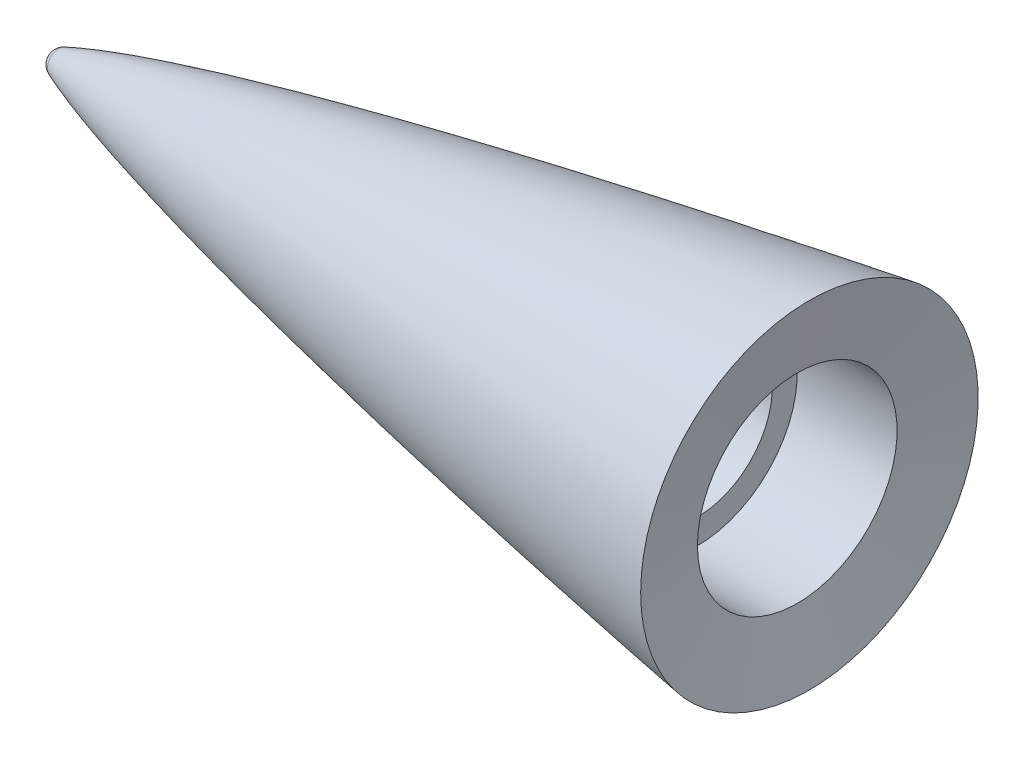
ISO-10303-21;
HEADER;
FILE_DESCRIPTION(('STEP AP214'),'2;1');
FILE_NAME('part.step','',(''),(''),'','','');
FILE_SCHEMA(('AUTOMOTIVE_DESIGN { 1 0 10303 214 1 1 1 1 }'));
ENDSEC;
DATA;
#1=APPLICATION_CONTEXT('core data for automotive mechanical design processes');
#2=APPLICATION_PROTOCOL_DEFINITION('international standard','automotive_design',2000,#1);
#3=PRODUCT_CONTEXT('',#1,'mechanical');
#4=PRODUCT('Part','Part','',(#3));
#5=PRODUCT_RELATED_PRODUCT_CATEGORY('part','',(#4));
#6=PRODUCT_DEFINITION_FORMATION('','',#4);
#7=PRODUCT_DEFINITION_CONTEXT('part definition',#1,'design');
#8=PRODUCT_DEFINITION('design','',#6,#7);
#9=PRODUCT_DEFINITION_SHAPE('','',#8);
#10=(LENGTH_UNIT() NAMED_UNIT(*) SI_UNIT(.MILLI.,.METRE.));
#11=(NAMED_UNIT(*) PLANE_ANGLE_UNIT() SI_UNIT($,.RADIAN.));
#12=(NAMED_UNIT(*) SI_UNIT($,.STERADIAN.) SOLID_ANGLE_UNIT());
#13=UNCERTAINTY_MEASURE_WITH_UNIT(LENGTH_MEASURE(1.E-05),#10,'distance_accuracy_value','');
#14=(GEOMETRIC_REPRESENTATION_CONTEXT(3) GLOBAL_UNCERTAINTY_ASSIGNED_CONTEXT((#13)) GLOBAL_UNIT_ASSIGNED_CONTEXT((#10,
#11,#12)) REPRESENTATION_CONTEXT('',''));
#15=CARTESIAN_POINT('',(0.,0.,0.));
#16=DIRECTION('',(0.,0.,1.));
#17=DIRECTION('',(1.,0.,0.));
#18=AXIS2_PLACEMENT_3D('',#15,#16,#17);
#19=CARTESIAN_POINT('',(83.9194053925777,0.,-12.6999999999991));
#20=DIRECTION('',(-1.,0.,0.));
#21=DIRECTION('',(0.,0.,1.));
#22=AXIS2_PLACEMENT_3D('',#19,#20,#21);
#23=PLANE('',#22);
#24=CARTESIAN_POINT('',(83.9194053925777,0.,0.));
#25=DIRECTION('',(-1.,0.,0.));
#26=DIRECTION('',(0.,0.,1.));
#27=AXIS2_PLACEMENT_3D('',#24,#25,#26);
#28=CIRCLE('',#27,12.6999999999991);
#29=CARTESIAN_POINT('',(83.9194053925777,0.,12.6999999999991));
#30=VERTEX_POINT('',#29);
#31=EDGE_CURVE('E11',#30,#30,#28,.T.);
#32=ORIENTED_EDGE('',*,*,#31,.F.);
#33=EDGE_LOOP('',(#32));
#34=FACE_BOUND('',#33,.T.);
#35=CARTESIAN_POINT('',(83.9194053925777,0.,0.));
#36=DIRECTION('',(-1.,0.,0.));
#37=DIRECTION('',(0.,0.,1.));
#38=AXIS2_PLACEMENT_3D('',#35,#36,#37);
#39=CIRCLE('',#38,9.525);
#40=CARTESIAN_POINT('',(83.9194053925777,0.,9.525));
#41=VERTEX_POINT('',#40);
#42=EDGE_CURVE('E69',#41,#41,#39,.T.);
#43=ORIENTED_EDGE('',*,*,#42,.T.);
#44=EDGE_LOOP('',(#43));
#45=FACE_BOUND('',#44,.T.);
#46=ADVANCED_FACE('F32',(#34,#45),#23,.F.);
#47=CARTESIAN_POINT('',(0.,0.,0.));
#48=DIRECTION('',(-1.,0.,0.));
#49=DIRECTION('',(0.,0.,1.));
#50=AXIS2_PLACEMENT_3D('',#47,#48,#49);
#51=CYLINDRICAL_SURFACE('',#50,12.6999999999991);
#52=CARTESIAN_POINT('',(96.6194053925777,0.,0.));
#53=DIRECTION('',(-1.,0.,0.));
#54=DIRECTION('',(0.,0.,1.));
#55=AXIS2_PLACEMENT_3D('',#52,#53,#54);
#56=CIRCLE('',#55,12.6999999999991);
#57=CARTESIAN_POINT('',(96.6194053925777,0.,12.6999999999991));
#58=VERTEX_POINT('',#57);
#59=EDGE_CURVE('E38',#58,#58,#56,.T.);
#60=ORIENTED_EDGE('',*,*,#59,.F.);
#61=EDGE_LOOP('',(#60));
#62=FACE_BOUND('',#61,.T.);
#63=ORIENTED_EDGE('',*,*,#31,.T.);
#64=EDGE_LOOP('',(#63));
#65=FACE_BOUND('',#64,.T.);
#66=ADVANCED_FACE('F58',(#62,#65),#51,.F.);
#67=CARTESIAN_POINT('',(96.6194053925777,0.,0.));
#68=DIRECTION('',(1.,0.,0.));
#69=DIRECTION('',(0.,0.,-1.));
#70=AXIS2_PLACEMENT_3D('',#67,#68,#69);
#71=CONICAL_SURFACE('',#70,12.6999999999991,1.3962634012734);
#72=CARTESIAN_POINT('',(98.1654285822377,0.,0.));
#73=DIRECTION('',(-1.,0.,0.));
#74=DIRECTION('',(0.,0.,1.));
#75=AXIS2_PLACEMENT_3D('',#72,#73,#74);
#76=CIRCLE('',#75,21.4679331917128);
#77=CARTESIAN_POINT('',(98.1654285822377,0.,21.4679331917128));
#78=VERTEX_POINT('',#77);
#79=EDGE_CURVE('E82',#78,#78,#76,.T.);
#80=ORIENTED_EDGE('',*,*,#79,.F.);
#81=EDGE_LOOP('',(#80));
#82=FACE_BOUND('',#81,.T.);
#83=ORIENTED_EDGE('',*,*,#59,.T.);
#84=EDGE_LOOP('',(#83));
#85=FACE_BOUND('',#84,.T.);
#86=ADVANCED_FACE('F63',(#82,#85),#71,.F.);
#87=CARTESIAN_POINT('',(98.1654285822377,0.,-21.4679331917128));
#88=CARTESIAN_POINT('',(98.164963491653,0.,-21.4678588449244));
#89=CARTESIAN_POINT('',(97.3333723487105,0.,-21.334925018947));
#90=CARTESIAN_POINT('',(95.6643282605515,0.,-21.0670430360893));
#91=CARTESIAN_POINT('',(92.4583875897154,0.,-20.5496454295419));
#92=CARTESIAN_POINT('',(89.1687402481209,0.,-20.01035749334));
#93=CARTESIAN_POINT('',(85.3070651026785,0.,-19.3724410882181));
#94=CARTESIAN_POINT('',(81.7849613772071,0.,-18.7812835294238));
#95=CARTESIAN_POINT('',(78.0654253465569,0.,-18.1506618123487));
#96=CARTESIAN_POINT('',(74.4590688039419,0.,-17.529825957153));
#97=CARTESIAN_POINT('',(69.8838967805536,0.,-16.7320623592298));
#98=CARTESIAN_POINT('',(64.433980883078,0.,-15.762645369331));
#99=CARTESIAN_POINT('',(58.0581539205274,0.,-14.599266319204));
#100=CARTESIAN_POINT('',(50.7937769881176,0.,-13.2269844957505));
#101=CARTESIAN_POINT('',(43.5319010479667,0.,-11.8011118443972));
#102=CARTESIAN_POINT('',(36.2869207738544,0.,-10.3137447182511));
#103=CARTESIAN_POINT('',(29.0553638889182,0.,-8.74917784058436));
#104=CARTESIAN_POINT('',(21.8473172630035,0.,-7.08667894424691));
#105=CARTESIAN_POINT('',(15.352608070185,0.,-5.45893404606891));
#106=CARTESIAN_POINT('',(9.95928520495974,0.,-3.96140285403248));
#107=CARTESIAN_POINT('',(6.07554274334884,0.,-2.73558534633014));
#108=CARTESIAN_POINT('',(3.98276576435626,0.,-1.9869769133939));
#109=CARTESIAN_POINT('',(2.98209212703007,0.,-1.59174228336096));
#110=CARTESIAN_POINT('',(2.6821271482151,0.,-1.46864436174974));
#111=B_SPLINE_CURVE_WITH_KNOTS('',4,(#87,#88,#89,#90,#91,#92,#93,#94,#95,#96,#97,#98,#99,#100,
#101,#102,#103,#104,#105,#106,#107,#108,#109,#110),.UNSPECIFIED.,.F.,.F.,(5,1,1,1,1,1,1,1,1,1,1,
1,1,1,1,1,1,1,1,1,5),(0.0278472915350182,0.0278659926056248,0.0612851050735975,0.09470421754157,
0.128123330738758,0.161542443935946,0.19496155644806,0.228380668960175,0.261799782409289,
0.295218895858403,0.362057120379117,0.428895345791075,0.495733571811544,0.562571797597869,
0.629410022064906,0.696248245183594,0.763086473220192,0.829924693268996,0.871354334931829,
0.898515123135413,0.910233153347239),.UNSPECIFIED.);
#112=CARTESIAN_POINT('',(0.,0.,0.));
#113=DIRECTION('',(-1.,0.,0.));
#114=AXIS1_PLACEMENT('',#112,#113);
#115=SURFACE_OF_REVOLUTION('',#111,#114);
#116=CARTESIAN_POINT('',(2.68212714820225,0.,0.));
#117=DIRECTION('',(-1.,0.,0.));
#118=DIRECTION('',(0.,0.,1.));
#119=AXIS2_PLACEMENT_3D('',#116,#117,#118);
#120=CIRCLE('',#119,1.46864436174447);
#121=CARTESIAN_POINT('',(2.68212714820225,0.,1.46864436174447));
#122=VERTEX_POINT('',#121);
#123=EDGE_CURVE('E73',#122,#122,#120,.T.);
#124=ORIENTED_EDGE('',*,*,#123,.F.);
#125=EDGE_LOOP('',(#124));
#126=FACE_BOUND('',#125,.T.);
#127=ORIENTED_EDGE('',*,*,#79,.T.);
#128=EDGE_LOOP('',(#127));
#129=FACE_BOUND('',#128,.T.);
#130=ADVANCED_FACE('F53',(#126,#129),#115,.T.);
#131=CARTESIAN_POINT('',(3.28482109105042,0.,-1.01075831732134E-11));
#132=DIRECTION('',(-1.,0.,0.));
#133=DIRECTION('',(0.,0.,-1.));
#134=AXIS2_PLACEMENT_3D('',#131,#132,#133);
#135=SPHERICAL_SURFACE('',#134,1.5875);
#136=ORIENTED_EDGE('',*,*,#123,.T.);
#137=EDGE_LOOP('',(#136));
#138=FACE_BOUND('',#137,.T.);
#139=ADVANCED_FACE('F44',(#138),#135,.T.);
#140=CARTESIAN_POINT('',(45.8194053925777,0.,0.));
#141=DIRECTION('',(1.,0.,0.));
#142=DIRECTION('',(0.,0.,-1.));
#143=AXIS2_PLACEMENT_3D('',#140,#141,#142);
#144=CONICAL_SURFACE('',#143,0.,0.643501108793284);
#145=CARTESIAN_POINT('',(58.5194053925776,0.,0.));
#146=DIRECTION('',(-1.,0.,0.));
#147=DIRECTION('',(0.,0.,1.));
#148=AXIS2_PLACEMENT_3D('',#145,#146,#147);
#149=CIRCLE('',#148,9.52499999999999);
#150=CARTESIAN_POINT('',(58.5194053925776,0.,9.52499999999999));
#151=VERTEX_POINT('',#150);
#152=EDGE_CURVE('E70',#151,#151,#149,.T.);
#153=ORIENTED_EDGE('',*,*,#152,.F.);
#154=EDGE_LOOP('',(#153));
#155=FACE_BOUND('',#154,.T.);
#156=CARTESIAN_POINT('',(45.8194053925777,0.,0.));
#157=VERTEX_POINT('',#156);
#158=VERTEX_LOOP('',#157);
#159=FACE_BOUND('',#158,.T.);
#160=ADVANCED_FACE('F41',(#155,#159),#144,.F.);
#161=CARTESIAN_POINT('',(0.,0.,0.));
#162=DIRECTION('',(-1.,0.,0.));
#163=DIRECTION('',(0.,0.,1.));
#164=AXIS2_PLACEMENT_3D('',#161,#162,#163);
#165=CYLINDRICAL_SURFACE('',#164,9.525);
#166=ORIENTED_EDGE('',*,*,#42,.F.);
#167=EDGE_LOOP('',(#166));
#168=FACE_BOUND('',#167,.T.);
#169=ORIENTED_EDGE('',*,*,#152,.T.);
#170=EDGE_LOOP('',(#169));
#171=FACE_BOUND('',#170,.T.);
#172=ADVANCED_FACE('F43',(#168,#171),#165,.F.);
#173=CLOSED_SHELL('',(#46,#66,#86,#130,#139,#160,#172));
#174=MANIFOLD_SOLID_BREP('B2',#173);
#175=ADVANCED_BREP_SHAPE_REPRESENTATION('',(#18,#174),#14);
#176=SHAPE_DEFINITION_REPRESENTATION(#9,#175);
ENDSEC;
END-ISO-10303-21;
